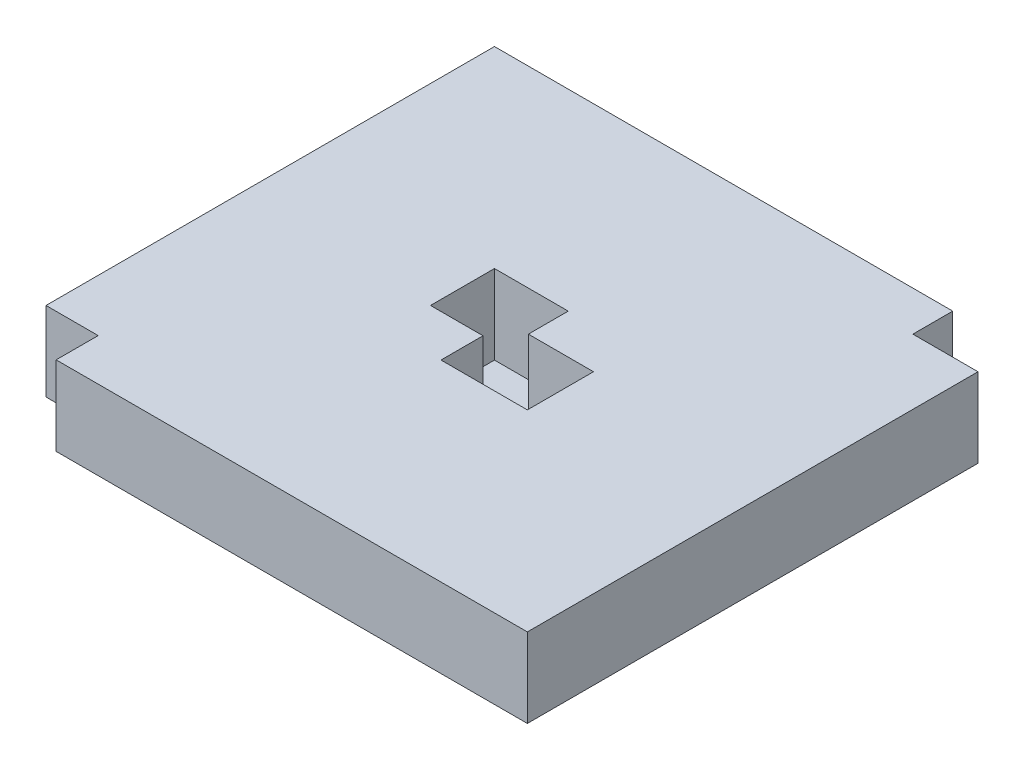
ISO-10303-21;
HEADER;
FILE_DESCRIPTION(('STEP AP214'),'2;1');
FILE_NAME('part.step','',(''),(''),'','','');
FILE_SCHEMA(('AUTOMOTIVE_DESIGN { 1 0 10303 214 1 1 1 1 }'));
ENDSEC;
DATA;
#1=APPLICATION_CONTEXT('core data for automotive mechanical design processes');
#2=APPLICATION_PROTOCOL_DEFINITION('international standard','automotive_design',2000,#1);
#3=PRODUCT_CONTEXT('',#1,'mechanical');
#4=PRODUCT('Part','Part','',(#3));
#5=PRODUCT_RELATED_PRODUCT_CATEGORY('part','',(#4));
#6=PRODUCT_DEFINITION_FORMATION('','',#4);
#7=PRODUCT_DEFINITION_CONTEXT('part definition',#1,'design');
#8=PRODUCT_DEFINITION('design','',#6,#7);
#9=PRODUCT_DEFINITION_SHAPE('','',#8);
#10=(LENGTH_UNIT() NAMED_UNIT(*) SI_UNIT(.MILLI.,.METRE.));
#11=(NAMED_UNIT(*) PLANE_ANGLE_UNIT() SI_UNIT($,.RADIAN.));
#12=(NAMED_UNIT(*) SI_UNIT($,.STERADIAN.) SOLID_ANGLE_UNIT());
#13=UNCERTAINTY_MEASURE_WITH_UNIT(LENGTH_MEASURE(1.E-05),#10,'distance_accuracy_value','');
#14=(GEOMETRIC_REPRESENTATION_CONTEXT(3) GLOBAL_UNCERTAINTY_ASSIGNED_CONTEXT((#13)) GLOBAL_UNIT_ASSIGNED_CONTEXT((#10,
#11,#12)) REPRESENTATION_CONTEXT('',''));
#15=CARTESIAN_POINT('',(0.,0.,0.));
#16=DIRECTION('',(0.,0.,1.));
#17=DIRECTION('',(1.,0.,0.));
#18=AXIS2_PLACEMENT_3D('',#15,#16,#17);
#19=CARTESIAN_POINT('',(0.,33.,0.));
#20=DIRECTION('',(0.,-1.,0.));
#21=DIRECTION('',(0.,0.,-1.));
#22=AXIS2_PLACEMENT_3D('',#19,#20,#21);
#23=CYLINDRICAL_SURFACE('',#22,49.571868137868);
#24=CARTESIAN_POINT('',(0.,33.,0.));
#25=DIRECTION('',(0.,1.,0.));
#26=DIRECTION('',(0.,0.,1.));
#27=AXIS2_PLACEMENT_3D('',#24,#25,#26);
#28=CIRCLE('',#27,49.571868137868);
#29=CARTESIAN_POINT('',(0.,33.,49.571868137868));
#30=VERTEX_POINT('',#29);
#31=EDGE_CURVE('E12',#30,#30,#28,.T.);
#32=ORIENTED_EDGE('',*,*,#31,.F.);
#33=EDGE_LOOP('',(#32));
#34=FACE_BOUND('',#33,.T.);
#35=CARTESIAN_POINT('',(0.,0.,0.));
#36=DIRECTION('',(0.,1.,0.));
#37=DIRECTION('',(0.,0.,1.));
#38=AXIS2_PLACEMENT_3D('',#35,#36,#37);
#39=CIRCLE('',#38,49.571868137868);
#40=CARTESIAN_POINT('',(0.,0.,49.571868137868));
#41=VERTEX_POINT('',#40);
#42=EDGE_CURVE('E99',#41,#41,#39,.T.);
#43=ORIENTED_EDGE('',*,*,#42,.T.);
#44=EDGE_LOOP('',(#43));
#45=FACE_BOUND('',#44,.T.);
#46=ADVANCED_FACE('F96',(#34,#45),#23,.T.);
#47=CARTESIAN_POINT('',(0.,0.,0.));
#48=DIRECTION('',(0.,1.,0.));
#49=DIRECTION('',(0.,0.,1.));
#50=AXIS2_PLACEMENT_3D('',#47,#48,#49);
#51=PLANE('',#50);
#52=ORIENTED_EDGE('',*,*,#42,.F.);
#53=EDGE_LOOP('',(#52));
#54=FACE_BOUND('',#53,.T.);
#55=ADVANCED_FACE('F340',(#54),#51,.F.);
#56=CARTESIAN_POINT('',(0.,66.,-90.0240440142948));
#57=DIRECTION('',(0.,0.,1.));
#58=DIRECTION('',(1.,0.,0.));
#59=AXIS2_PLACEMENT_3D('',#56,#57,#58);
#60=PLANE('',#59);
#61=DIRECTION('',(0.,-1.,0.));
#62=VECTOR('',#61,1.);
#63=CARTESIAN_POINT('',(80.,66.,-90.0240440142948));
#64=LINE('',#63,#62);
#65=CARTESIAN_POINT('',(80.,66.,-90.0240440142948));
#66=VERTEX_POINT('',#65);
#67=CARTESIAN_POINT('',(80.,33.,-90.0240440142948));
#68=VERTEX_POINT('',#67);
#69=EDGE_CURVE('E227',#66,#68,#64,.T.);
#70=ORIENTED_EDGE('',*,*,#69,.F.);
#71=DIRECTION('',(-1.,0.,0.));
#72=VECTOR('',#71,1.);
#73=CARTESIAN_POINT('',(0.,66.,-90.0240440142948));
#74=LINE('',#73,#72);
#75=CARTESIAN_POINT('',(107.09948450761,66.,-90.0240440142948));
#76=VERTEX_POINT('',#75);
#77=EDGE_CURVE('E283',#76,#66,#74,.T.);
#78=ORIENTED_EDGE('',*,*,#77,.F.);
#79=DIRECTION('',(0.,-1.,0.));
#80=VECTOR('',#79,1.);
#81=CARTESIAN_POINT('',(107.09948450761,66.,-90.0240440142948));
#82=LINE('',#81,#80);
#83=CARTESIAN_POINT('',(107.09948450761,33.,-90.0240440142948));
#84=VERTEX_POINT('',#83);
#85=EDGE_CURVE('E301',#76,#84,#82,.T.);
#86=ORIENTED_EDGE('',*,*,#85,.T.);
#87=DIRECTION('',(-1.,0.,0.));
#88=VECTOR('',#87,1.);
#89=CARTESIAN_POINT('',(0.,33.,-90.0240440142948));
#90=LINE('',#89,#88);
#91=EDGE_CURVE('E282',#84,#68,#90,.T.);
#92=ORIENTED_EDGE('',*,*,#91,.T.);
#93=EDGE_LOOP('',(#70,#78,#86,#92));
#94=FACE_BOUND('',#93,.T.);
#95=ADVANCED_FACE('F342',(#94),#60,.F.);
#96=CARTESIAN_POINT('',(-88.9870739438504,66.,0.));
#97=DIRECTION('',(1.,0.,0.));
#98=DIRECTION('',(0.,0.,-1.));
#99=AXIS2_PLACEMENT_3D('',#96,#97,#98);
#100=PLANE('',#99);
#101=DIRECTION('',(0.,1.,0.));
#102=VECTOR('',#101,1.);
#103=CARTESIAN_POINT('',(-88.9870739438504,66.,80.));
#104=LINE('',#103,#102);
#105=CARTESIAN_POINT('',(-88.9870739438504,33.,80.));
#106=VERTEX_POINT('',#105);
#107=CARTESIAN_POINT('',(-88.9870739438504,66.,80.));
#108=VERTEX_POINT('',#107);
#109=EDGE_CURVE('E279',#106,#108,#104,.T.);
#110=ORIENTED_EDGE('',*,*,#109,.F.);
#111=DIRECTION('',(0.,0.,-1.));
#112=VECTOR('',#111,1.);
#113=CARTESIAN_POINT('',(-88.9870739438504,33.,0.));
#114=LINE('',#113,#112);
#115=CARTESIAN_POINT('',(-88.9870739438504,33.,97.4902285214933));
#116=VERTEX_POINT('',#115);
#117=EDGE_CURVE('E313',#106,#116,#114,.F.);
#118=ORIENTED_EDGE('',*,*,#117,.T.);
#119=DIRECTION('',(0.,-1.,0.));
#120=VECTOR('',#119,1.);
#121=CARTESIAN_POINT('',(-88.9870739438504,66.,97.4902285214933));
#122=LINE('',#121,#120);
#123=CARTESIAN_POINT('',(-88.9870739438504,66.,97.4902285214933));
#124=VERTEX_POINT('',#123);
#125=EDGE_CURVE('E323',#124,#116,#122,.T.);
#126=ORIENTED_EDGE('',*,*,#125,.F.);
#127=DIRECTION('',(0.,0.,-1.));
#128=VECTOR('',#127,1.);
#129=CARTESIAN_POINT('',(-88.9870739438504,66.,0.));
#130=LINE('',#129,#128);
#131=EDGE_CURVE('E218',#108,#124,#130,.F.);
#132=ORIENTED_EDGE('',*,*,#131,.F.);
#133=EDGE_LOOP('',(#110,#118,#126,#132));
#134=FACE_BOUND('',#133,.T.);
#135=ADVANCED_FACE('F347',(#134),#100,.F.);
#136=CARTESIAN_POINT('',(0.,66.,-10.0240440142948));
#137=DIRECTION('',(-1.,0.,0.));
#138=DIRECTION('',(0.,0.,1.));
#139=AXIS2_PLACEMENT_3D('',#136,#137,#138);
#140=PLANE('',#139);
#141=DIRECTION('',(0.,0.,-1.));
#142=VECTOR('',#141,1.);
#143=CARTESIAN_POINT('',(0.,66.,-10.0240440142948));
#144=LINE('',#143,#142);
#145=CARTESIAN_POINT('',(0.,66.,-10.0240440142948));
#146=VERTEX_POINT('',#145);
#147=CARTESIAN_POINT('',(0.,66.,-26.6155651414032));
#148=VERTEX_POINT('',#147);
#149=EDGE_CURVE('E286',#146,#148,#144,.T.);
#150=ORIENTED_EDGE('',*,*,#149,.T.);
#151=DIRECTION('',(0.,-1.,0.));
#152=VECTOR('',#151,1.);
#153=CARTESIAN_POINT('',(0.,66.,-26.6155651414032));
#154=LINE('',#153,#152);
#155=CARTESIAN_POINT('',(0.,33.,-26.6155651414032));
#156=VERTEX_POINT('',#155);
#157=EDGE_CURVE('E270',#148,#156,#154,.T.);
#158=ORIENTED_EDGE('',*,*,#157,.T.);
#159=DIRECTION('',(0.,0.,-1.));
#160=VECTOR('',#159,1.);
#161=CARTESIAN_POINT('',(0.,33.,-10.0240440142948));
#162=LINE('',#161,#160);
#163=CARTESIAN_POINT('',(0.,33.,-10.0240440142948));
#164=VERTEX_POINT('',#163);
#165=EDGE_CURVE('E115',#164,#156,#162,.T.);
#166=ORIENTED_EDGE('',*,*,#165,.F.);
#167=DIRECTION('',(0.,-1.,0.));
#168=VECTOR('',#167,1.);
#169=CARTESIAN_POINT('',(0.,66.,-10.0240440142948));
#170=LINE('',#169,#168);
#171=EDGE_CURVE('E332',#146,#164,#170,.T.);
#172=ORIENTED_EDGE('',*,*,#171,.F.);
#173=EDGE_LOOP('',(#150,#158,#166,#172));
#174=FACE_BOUND('',#173,.T.);
#175=ADVANCED_FACE('F355',(#174),#140,.T.);
#176=CARTESIAN_POINT('',(0.,66.,-10.0240440142948));
#177=DIRECTION('',(0.,0.,1.));
#178=DIRECTION('',(1.,0.,0.));
#179=AXIS2_PLACEMENT_3D('',#176,#177,#178);
#180=PLANE('',#179);
#181=DIRECTION('',(-1.,0.,0.));
#182=VECTOR('',#181,1.);
#183=CARTESIAN_POINT('',(0.,33.,-10.0240440142948));
#184=LINE('',#183,#182);
#185=CARTESIAN_POINT('',(27.0994845076104,33.,-10.0240440142948));
#186=VERTEX_POINT('',#185);
#187=EDGE_CURVE('E305',#186,#164,#184,.T.);
#188=ORIENTED_EDGE('',*,*,#187,.F.);
#189=DIRECTION('',(0.,-1.,0.));
#190=VECTOR('',#189,1.);
#191=CARTESIAN_POINT('',(27.0994845076104,66.,-10.0240440142948));
#192=LINE('',#191,#190);
#193=CARTESIAN_POINT('',(27.0994845076104,66.,-10.0240440142948));
#194=VERTEX_POINT('',#193);
#195=EDGE_CURVE('E329',#194,#186,#192,.T.);
#196=ORIENTED_EDGE('',*,*,#195,.F.);
#197=DIRECTION('',(-1.,0.,0.));
#198=VECTOR('',#197,1.);
#199=CARTESIAN_POINT('',(0.,66.,-10.0240440142948));
#200=LINE('',#199,#198);
#201=EDGE_CURVE('E289',#194,#146,#200,.T.);
#202=ORIENTED_EDGE('',*,*,#201,.T.);
#203=ORIENTED_EDGE('',*,*,#171,.T.);
#204=EDGE_LOOP('',(#188,#196,#202,#203));
#205=FACE_BOUND('',#204,.T.);
#206=ADVANCED_FACE('F358',(#205),#180,.T.);
#207=CARTESIAN_POINT('',(27.0994845076104,66.,-10.0240440142948));
#208=DIRECTION('',(-1.,0.,0.));
#209=DIRECTION('',(0.,0.,1.));
#210=AXIS2_PLACEMENT_3D('',#207,#208,#209);
#211=PLANE('',#210);
#212=DIRECTION('',(0.,0.,-1.));
#213=VECTOR('',#212,1.);
#214=CARTESIAN_POINT('',(27.0994845076104,33.,-10.0240440142948));
#215=LINE('',#214,#213);
#216=CARTESIAN_POINT('',(27.0994845076104,33.,17.4902285214933));
#217=VERTEX_POINT('',#216);
#218=EDGE_CURVE('E307',#217,#186,#215,.T.);
#219=ORIENTED_EDGE('',*,*,#218,.F.);
#220=DIRECTION('',(0.,-1.,0.));
#221=VECTOR('',#220,1.);
#222=CARTESIAN_POINT('',(27.0994845076104,66.,17.4902285214933));
#223=LINE('',#222,#221);
#224=CARTESIAN_POINT('',(27.0994845076104,66.,17.4902285214933));
#225=VERTEX_POINT('',#224);
#226=EDGE_CURVE('E326',#225,#217,#223,.T.);
#227=ORIENTED_EDGE('',*,*,#226,.F.);
#228=DIRECTION('',(0.,0.,-1.));
#229=VECTOR('',#228,1.);
#230=CARTESIAN_POINT('',(27.0994845076104,66.,-10.0240440142948));
#231=LINE('',#230,#229);
#232=EDGE_CURVE('E292',#225,#194,#231,.T.);
#233=ORIENTED_EDGE('',*,*,#232,.T.);
#234=ORIENTED_EDGE('',*,*,#195,.T.);
#235=EDGE_LOOP('',(#219,#227,#233,#234));
#236=FACE_BOUND('',#235,.T.);
#237=ADVANCED_FACE('F362',(#236),#211,.T.);
#238=CARTESIAN_POINT('',(-8.98707394385037,66.,17.4902285214933));
#239=DIRECTION('',(0.,0.,-1.));
#240=DIRECTION('',(-1.,0.,0.));
#241=AXIS2_PLACEMENT_3D('',#238,#239,#240);
#242=PLANE('',#241);
#243=DIRECTION('',(0.,-1.,0.));
#244=VECTOR('',#243,1.);
#245=CARTESIAN_POINT('',(-8.84881126779113,66.,17.4902285214933));
#246=LINE('',#245,#244);
#247=CARTESIAN_POINT('',(-8.84881126779113,66.,17.4902285214933));
#248=VERTEX_POINT('',#247);
#249=CARTESIAN_POINT('',(-8.84881126779113,33.,17.4902285214933));
#250=VERTEX_POINT('',#249);
#251=EDGE_CURVE('E277',#248,#250,#246,.T.);
#252=ORIENTED_EDGE('',*,*,#251,.F.);
#253=DIRECTION('',(1.,0.,0.));
#254=VECTOR('',#253,1.);
#255=CARTESIAN_POINT('',(-8.98707394385037,66.,17.4902285214933));
#256=LINE('',#255,#254);
#257=EDGE_CURVE('E219',#248,#225,#256,.T.);
#258=ORIENTED_EDGE('',*,*,#257,.T.);
#259=ORIENTED_EDGE('',*,*,#226,.T.);
#260=DIRECTION('',(1.,0.,0.));
#261=VECTOR('',#260,1.);
#262=CARTESIAN_POINT('',(-8.98707394385037,33.,17.4902285214933));
#263=LINE('',#262,#261);
#264=EDGE_CURVE('E309',#250,#217,#263,.T.);
#265=ORIENTED_EDGE('',*,*,#264,.F.);
#266=EDGE_LOOP('',(#252,#258,#259,#265));
#267=FACE_BOUND('',#266,.T.);
#268=ADVANCED_FACE('F365',(#267),#242,.T.);
#269=CARTESIAN_POINT('',(-88.9870739438504,66.,0.));
#270=DIRECTION('',(0.,0.,-1.));
#271=DIRECTION('',(-1.,0.,0.));
#272=AXIS2_PLACEMENT_3D('',#269,#270,#271);
#273=PLANE('',#272);
#274=DIRECTION('',(0.,-1.,0.));
#275=VECTOR('',#274,1.);
#276=CARTESIAN_POINT('',(-30.6943140851505,66.,0.));
#277=LINE('',#276,#275);
#278=CARTESIAN_POINT('',(-30.6943140851505,66.,0.));
#279=VERTEX_POINT('',#278);
#280=CARTESIAN_POINT('',(-30.6943140851505,33.,0.));
#281=VERTEX_POINT('',#280);
#282=EDGE_CURVE('E213',#279,#281,#277,.T.);
#283=ORIENTED_EDGE('',*,*,#282,.F.);
#284=DIRECTION('',(1.,0.,0.));
#285=VECTOR('',#284,1.);
#286=CARTESIAN_POINT('',(-88.9870739438504,66.,0.));
#287=LINE('',#286,#285);
#288=CARTESIAN_POINT('',(-8.84881126779113,66.,0.));
#289=VERTEX_POINT('',#288);
#290=EDGE_CURVE('E206',#279,#289,#287,.T.);
#291=ORIENTED_EDGE('',*,*,#290,.T.);
#292=DIRECTION('',(0.,-1.,0.));
#293=VECTOR('',#292,1.);
#294=CARTESIAN_POINT('',(-8.84881126779113,66.,0.));
#295=LINE('',#294,#293);
#296=CARTESIAN_POINT('',(-8.84881126779113,33.,0.));
#297=VERTEX_POINT('',#296);
#298=EDGE_CURVE('E210',#289,#297,#295,.T.);
#299=ORIENTED_EDGE('',*,*,#298,.T.);
#300=DIRECTION('',(1.,0.,0.));
#301=VECTOR('',#300,1.);
#302=CARTESIAN_POINT('',(-88.9870739438504,33.,0.));
#303=LINE('',#302,#301);
#304=EDGE_CURVE('E311',#281,#297,#303,.T.);
#305=ORIENTED_EDGE('',*,*,#304,.F.);
#306=EDGE_LOOP('',(#283,#291,#299,#305));
#307=FACE_BOUND('',#306,.T.);
#308=ADVANCED_FACE('F208',(#307),#273,.T.);
#309=CARTESIAN_POINT('',(-8.98707394385037,66.,97.4902285214933));
#310=DIRECTION('',(0.,0.,-1.));
#311=DIRECTION('',(-1.,0.,0.));
#312=AXIS2_PLACEMENT_3D('',#309,#310,#311);
#313=PLANE('',#312);
#314=DIRECTION('',(1.,0.,0.));
#315=VECTOR('',#314,1.);
#316=CARTESIAN_POINT('',(-8.98707394385037,33.,97.4902285214933));
#317=LINE('',#316,#315);
#318=CARTESIAN_POINT('',(107.09948450761,33.,97.4902285214933));
#319=VERTEX_POINT('',#318);
#320=EDGE_CURVE('E315',#116,#319,#317,.T.);
#321=ORIENTED_EDGE('',*,*,#320,.T.);
#322=DIRECTION('',(0.,-1.,0.));
#323=VECTOR('',#322,1.);
#324=CARTESIAN_POINT('',(107.09948450761,66.,97.4902285214933));
#325=LINE('',#324,#323);
#326=CARTESIAN_POINT('',(107.09948450761,66.,97.4902285214933));
#327=VERTEX_POINT('',#326);
#328=EDGE_CURVE('E320',#327,#319,#325,.T.);
#329=ORIENTED_EDGE('',*,*,#328,.F.);
#330=DIRECTION('',(1.,0.,0.));
#331=VECTOR('',#330,1.);
#332=CARTESIAN_POINT('',(-8.98707394385037,66.,97.4902285214933));
#333=LINE('',#332,#331);
#334=EDGE_CURVE('E297',#124,#327,#333,.T.);
#335=ORIENTED_EDGE('',*,*,#334,.F.);
#336=ORIENTED_EDGE('',*,*,#125,.T.);
#337=EDGE_LOOP('',(#321,#329,#335,#336));
#338=FACE_BOUND('',#337,.T.);
#339=ADVANCED_FACE('F372',(#338),#313,.F.);
#340=CARTESIAN_POINT('',(107.09948450761,66.,-10.0240440142948));
#341=DIRECTION('',(-1.,0.,0.));
#342=DIRECTION('',(0.,0.,1.));
#343=AXIS2_PLACEMENT_3D('',#340,#341,#342);
#344=PLANE('',#343);
#345=DIRECTION('',(0.,0.,-1.));
#346=VECTOR('',#345,1.);
#347=CARTESIAN_POINT('',(107.09948450761,33.,-10.0240440142948));
#348=LINE('',#347,#346);
#349=EDGE_CURVE('E287',#319,#84,#348,.T.);
#350=ORIENTED_EDGE('',*,*,#349,.T.);
#351=ORIENTED_EDGE('',*,*,#85,.F.);
#352=DIRECTION('',(0.,0.,-1.));
#353=VECTOR('',#352,1.);
#354=CARTESIAN_POINT('',(107.09948450761,66.,-10.0240440142948));
#355=LINE('',#354,#353);
#356=EDGE_CURVE('E299',#327,#76,#355,.T.);
#357=ORIENTED_EDGE('',*,*,#356,.F.);
#358=ORIENTED_EDGE('',*,*,#328,.T.);
#359=EDGE_LOOP('',(#350,#351,#357,#358));
#360=FACE_BOUND('',#359,.T.);
#361=ADVANCED_FACE('F378',(#360),#344,.F.);
#362=CARTESIAN_POINT('',(0.,66.,0.));
#363=DIRECTION('',(0.,-1.,0.));
#364=DIRECTION('',(-1.,0.,0.));
#365=AXIS2_PLACEMENT_3D('',#362,#363,#364);
#366=PLANE('',#365);
#367=ORIENTED_EDGE('',*,*,#77,.T.);
#368=DIRECTION('',(0.,0.,-1.));
#369=VECTOR('',#368,1.);
#370=CARTESIAN_POINT('',(80.,66.,-26.6155651414032));
#371=LINE('',#370,#369);
#372=CARTESIAN_POINT('',(80.,66.,-106.615565141403));
#373=VERTEX_POINT('',#372);
#374=EDGE_CURVE('E243',#66,#373,#371,.T.);
#375=ORIENTED_EDGE('',*,*,#374,.T.);
#376=DIRECTION('',(1.,0.,0.));
#377=VECTOR('',#376,1.);
#378=CARTESIAN_POINT('',(-30.6943140851505,66.,-106.615565141403));
#379=LINE('',#378,#377);
#380=CARTESIAN_POINT('',(-110.694314085151,66.,-106.615565141403));
#381=VERTEX_POINT('',#380);
#382=EDGE_CURVE('E245',#373,#381,#379,.F.);
#383=ORIENTED_EDGE('',*,*,#382,.T.);
#384=DIRECTION('',(0.,0.,-1.));
#385=VECTOR('',#384,1.);
#386=CARTESIAN_POINT('',(-110.694314085151,66.,-26.6155651414032));
#387=LINE('',#386,#385);
#388=CARTESIAN_POINT('',(-110.694314085151,66.,80.));
#389=VERTEX_POINT('',#388);
#390=EDGE_CURVE('E247',#381,#389,#387,.F.);
#391=ORIENTED_EDGE('',*,*,#390,.T.);
#392=DIRECTION('',(1.,0.,0.));
#393=VECTOR('',#392,1.);
#394=CARTESIAN_POINT('',(-30.6943140851505,66.,80.));
#395=LINE('',#394,#393);
#396=EDGE_CURVE('E233',#389,#108,#395,.T.);
#397=ORIENTED_EDGE('',*,*,#396,.T.);
#398=ORIENTED_EDGE('',*,*,#131,.T.);
#399=ORIENTED_EDGE('',*,*,#334,.T.);
#400=ORIENTED_EDGE('',*,*,#356,.T.);
#401=EDGE_LOOP('',(#367,#375,#383,#391,#397,#398,#399,#400));
#402=FACE_BOUND('',#401,.T.);
#403=ORIENTED_EDGE('',*,*,#257,.F.);
#404=DIRECTION('',(0.,0.,1.));
#405=VECTOR('',#404,1.);
#406=CARTESIAN_POINT('',(-8.84881126779113,66.,0.));
#407=LINE('',#406,#405);
#408=EDGE_CURVE('E224',#289,#248,#407,.T.);
#409=ORIENTED_EDGE('',*,*,#408,.F.);
#410=ORIENTED_EDGE('',*,*,#290,.F.);
#411=DIRECTION('',(0.,0.,1.));
#412=VECTOR('',#411,1.);
#413=CARTESIAN_POINT('',(-30.6943140851505,66.,-26.6155651414032));
#414=LINE('',#413,#412);
#415=CARTESIAN_POINT('',(-30.6943140851505,66.,-26.6155651414032));
#416=VERTEX_POINT('',#415);
#417=EDGE_CURVE('E232',#416,#279,#414,.T.);
#418=ORIENTED_EDGE('',*,*,#417,.F.);
#419=DIRECTION('',(-1.,0.,0.));
#420=VECTOR('',#419,1.);
#421=CARTESIAN_POINT('',(-30.6943140851505,66.,-26.6155651414032));
#422=LINE('',#421,#420);
#423=EDGE_CURVE('E235',#148,#416,#422,.T.);
#424=ORIENTED_EDGE('',*,*,#423,.F.);
#425=ORIENTED_EDGE('',*,*,#149,.F.);
#426=ORIENTED_EDGE('',*,*,#201,.F.);
#427=ORIENTED_EDGE('',*,*,#232,.F.);
#428=EDGE_LOOP('',(#403,#409,#410,#418,#424,#425,#426,#427));
#429=FACE_BOUND('',#428,.T.);
#430=ADVANCED_FACE('F230',(#402,#429),#366,.F.);
#431=CARTESIAN_POINT('',(0.,33.,0.));
#432=DIRECTION('',(0.,-1.,0.));
#433=DIRECTION('',(-1.,0.,0.));
#434=AXIS2_PLACEMENT_3D('',#431,#432,#433);
#435=PLANE('',#434);
#436=ORIENTED_EDGE('',*,*,#31,.T.);
#437=EDGE_LOOP('',(#436));
#438=FACE_BOUND('',#437,.T.);
#439=DIRECTION('',(0.,0.,-1.));
#440=VECTOR('',#439,1.);
#441=CARTESIAN_POINT('',(80.,33.,-26.6155651414032));
#442=LINE('',#441,#440);
#443=CARTESIAN_POINT('',(80.,33.,-106.615565141403));
#444=VERTEX_POINT('',#443);
#445=EDGE_CURVE('E257',#68,#444,#442,.T.);
#446=ORIENTED_EDGE('',*,*,#445,.F.);
#447=ORIENTED_EDGE('',*,*,#91,.F.);
#448=ORIENTED_EDGE('',*,*,#349,.F.);
#449=ORIENTED_EDGE('',*,*,#320,.F.);
#450=ORIENTED_EDGE('',*,*,#117,.F.);
#451=DIRECTION('',(1.,0.,0.));
#452=VECTOR('',#451,1.);
#453=CARTESIAN_POINT('',(-30.6943140851505,33.,80.));
#454=LINE('',#453,#452);
#455=CARTESIAN_POINT('',(-110.694314085151,33.,80.));
#456=VERTEX_POINT('',#455);
#457=EDGE_CURVE('E250',#456,#106,#454,.T.);
#458=ORIENTED_EDGE('',*,*,#457,.F.);
#459=DIRECTION('',(0.,0.,-1.));
#460=VECTOR('',#459,1.);
#461=CARTESIAN_POINT('',(-110.694314085151,33.,-26.6155651414032));
#462=LINE('',#461,#460);
#463=CARTESIAN_POINT('',(-110.694314085151,33.,-106.615565141403));
#464=VERTEX_POINT('',#463);
#465=EDGE_CURVE('E238',#464,#456,#462,.F.);
#466=ORIENTED_EDGE('',*,*,#465,.F.);
#467=DIRECTION('',(1.,0.,0.));
#468=VECTOR('',#467,1.);
#469=CARTESIAN_POINT('',(-30.6943140851505,33.,-106.615565141403));
#470=LINE('',#469,#468);
#471=EDGE_CURVE('E259',#444,#464,#470,.F.);
#472=ORIENTED_EDGE('',*,*,#471,.F.);
#473=EDGE_LOOP('',(#446,#447,#448,#449,#450,#458,#466,#472));
#474=FACE_BOUND('',#473,.T.);
#475=ADVANCED_FACE('F383',(#438,#474),#435,.T.);
#476=CARTESIAN_POINT('',(-30.6943140851505,66.,-106.615565141403));
#477=DIRECTION('',(0.,0.,1.));
#478=DIRECTION('',(1.,0.,0.));
#479=AXIS2_PLACEMENT_3D('',#476,#477,#478);
#480=PLANE('',#479);
#481=ORIENTED_EDGE('',*,*,#471,.T.);
#482=DIRECTION('',(0.,-1.,0.));
#483=VECTOR('',#482,1.);
#484=CARTESIAN_POINT('',(-110.694314085151,66.,-106.615565141403));
#485=LINE('',#484,#483);
#486=EDGE_CURVE('E264',#381,#464,#485,.T.);
#487=ORIENTED_EDGE('',*,*,#486,.F.);
#488=ORIENTED_EDGE('',*,*,#382,.F.);
#489=DIRECTION('',(0.,-1.,0.));
#490=VECTOR('',#489,1.);
#491=CARTESIAN_POINT('',(80.,66.,-106.615565141403));
#492=LINE('',#491,#490);
#493=EDGE_CURVE('E267',#373,#444,#492,.T.);
#494=ORIENTED_EDGE('',*,*,#493,.T.);
#495=EDGE_LOOP('',(#481,#487,#488,#494));
#496=FACE_BOUND('',#495,.T.);
#497=ADVANCED_FACE('F386',(#496),#480,.F.);
#498=CARTESIAN_POINT('',(-110.694314085151,66.,-26.6155651414032));
#499=DIRECTION('',(1.,0.,0.));
#500=DIRECTION('',(0.,0.,-1.));
#501=AXIS2_PLACEMENT_3D('',#498,#499,#500);
#502=PLANE('',#501);
#503=ORIENTED_EDGE('',*,*,#465,.T.);
#504=DIRECTION('',(0.,-1.,0.));
#505=VECTOR('',#504,1.);
#506=CARTESIAN_POINT('',(-110.694314085151,66.,80.));
#507=LINE('',#506,#505);
#508=EDGE_CURVE('E249',#389,#456,#507,.T.);
#509=ORIENTED_EDGE('',*,*,#508,.F.);
#510=ORIENTED_EDGE('',*,*,#390,.F.);
#511=ORIENTED_EDGE('',*,*,#486,.T.);
#512=EDGE_LOOP('',(#503,#509,#510,#511));
#513=FACE_BOUND('',#512,.T.);
#514=ADVANCED_FACE('F395',(#513),#502,.F.);
#515=CARTESIAN_POINT('',(-30.6943140851505,66.,80.));
#516=DIRECTION('',(0.,0.,-1.));
#517=DIRECTION('',(-1.,0.,0.));
#518=AXIS2_PLACEMENT_3D('',#515,#516,#517);
#519=PLANE('',#518);
#520=ORIENTED_EDGE('',*,*,#457,.T.);
#521=ORIENTED_EDGE('',*,*,#109,.T.);
#522=ORIENTED_EDGE('',*,*,#396,.F.);
#523=ORIENTED_EDGE('',*,*,#508,.T.);
#524=EDGE_LOOP('',(#520,#521,#522,#523));
#525=FACE_BOUND('',#524,.T.);
#526=ADVANCED_FACE('F391',(#525),#519,.F.);
#527=CARTESIAN_POINT('',(-30.6943140851505,66.,-26.6155651414032));
#528=DIRECTION('',(1.,0.,0.));
#529=DIRECTION('',(0.,0.,-1.));
#530=AXIS2_PLACEMENT_3D('',#527,#528,#529);
#531=PLANE('',#530);
#532=DIRECTION('',(0.,0.,1.));
#533=VECTOR('',#532,1.);
#534=CARTESIAN_POINT('',(-30.6943140851505,33.,-26.6155651414032));
#535=LINE('',#534,#533);
#536=CARTESIAN_POINT('',(-30.6943140851505,33.,-26.6155651414032));
#537=VERTEX_POINT('',#536);
#538=EDGE_CURVE('E254',#537,#281,#535,.T.);
#539=ORIENTED_EDGE('',*,*,#538,.F.);
#540=DIRECTION('',(0.,-1.,0.));
#541=VECTOR('',#540,1.);
#542=CARTESIAN_POINT('',(-30.6943140851505,66.,-26.6155651414032));
#543=LINE('',#542,#541);
#544=EDGE_CURVE('E273',#416,#537,#543,.T.);
#545=ORIENTED_EDGE('',*,*,#544,.F.);
#546=ORIENTED_EDGE('',*,*,#417,.T.);
#547=ORIENTED_EDGE('',*,*,#282,.T.);
#548=EDGE_LOOP('',(#539,#545,#546,#547));
#549=FACE_BOUND('',#548,.T.);
#550=ADVANCED_FACE('F394',(#549),#531,.T.);
#551=CARTESIAN_POINT('',(-30.6943140851505,66.,-26.6155651414032));
#552=DIRECTION('',(0.,0.,1.));
#553=DIRECTION('',(1.,0.,0.));
#554=AXIS2_PLACEMENT_3D('',#551,#552,#553);
#555=PLANE('',#554);
#556=DIRECTION('',(-1.,0.,0.));
#557=VECTOR('',#556,1.);
#558=CARTESIAN_POINT('',(-30.6943140851505,33.,-26.6155651414032));
#559=LINE('',#558,#557);
#560=EDGE_CURVE('E110',#156,#537,#559,.T.);
#561=ORIENTED_EDGE('',*,*,#560,.F.);
#562=ORIENTED_EDGE('',*,*,#157,.F.);
#563=ORIENTED_EDGE('',*,*,#423,.T.);
#564=ORIENTED_EDGE('',*,*,#544,.T.);
#565=EDGE_LOOP('',(#561,#562,#563,#564));
#566=FACE_BOUND('',#565,.T.);
#567=ADVANCED_FACE('F402',(#566),#555,.T.);
#568=CARTESIAN_POINT('',(80.,66.,-26.6155651414032));
#569=DIRECTION('',(-1.,0.,0.));
#570=DIRECTION('',(0.,0.,1.));
#571=AXIS2_PLACEMENT_3D('',#568,#569,#570);
#572=PLANE('',#571);
#573=ORIENTED_EDGE('',*,*,#374,.F.);
#574=ORIENTED_EDGE('',*,*,#69,.T.);
#575=ORIENTED_EDGE('',*,*,#445,.T.);
#576=ORIENTED_EDGE('',*,*,#493,.F.);
#577=EDGE_LOOP('',(#573,#574,#575,#576));
#578=FACE_BOUND('',#577,.T.);
#579=ADVANCED_FACE('F399',(#578),#572,.F.);
#580=CARTESIAN_POINT('',(-8.84881126779113,66.,0.));
#581=DIRECTION('',(1.,0.,0.));
#582=DIRECTION('',(0.,0.,-1.));
#583=AXIS2_PLACEMENT_3D('',#580,#581,#582);
#584=PLANE('',#583);
#585=ORIENTED_EDGE('',*,*,#408,.T.);
#586=ORIENTED_EDGE('',*,*,#251,.T.);
#587=DIRECTION('',(0.,0.,1.));
#588=VECTOR('',#587,1.);
#589=CARTESIAN_POINT('',(-8.84881126779113,33.,0.));
#590=LINE('',#589,#588);
#591=EDGE_CURVE('E226',#297,#250,#590,.T.);
#592=ORIENTED_EDGE('',*,*,#591,.F.);
#593=ORIENTED_EDGE('',*,*,#298,.F.);
#594=EDGE_LOOP('',(#585,#586,#592,#593));
#595=FACE_BOUND('',#594,.T.);
#596=ADVANCED_FACE('F222',(#595),#584,.T.);
#597=CARTESIAN_POINT('',(0.,33.,0.));
#598=DIRECTION('',(0.,1.,0.));
#599=DIRECTION('',(0.,0.,1.));
#600=AXIS2_PLACEMENT_3D('',#597,#598,#599);
#601=PLANE('',#600);
#602=ORIENTED_EDGE('',*,*,#538,.T.);
#603=ORIENTED_EDGE('',*,*,#304,.T.);
#604=ORIENTED_EDGE('',*,*,#591,.T.);
#605=ORIENTED_EDGE('',*,*,#264,.T.);
#606=ORIENTED_EDGE('',*,*,#218,.T.);
#607=ORIENTED_EDGE('',*,*,#187,.T.);
#608=ORIENTED_EDGE('',*,*,#165,.T.);
#609=ORIENTED_EDGE('',*,*,#560,.T.);
#610=EDGE_LOOP('',(#602,#603,#604,#605,#606,#607,#608,#609));
#611=FACE_BOUND('',#610,.T.);
#612=ADVANCED_FACE('F352',(#611),#601,.T.);
#613=CLOSED_SHELL('',(#46,#55,#95,#135,#175,#206,#237,#268,#308,#339,#361,#430,#475,#497,#514,
#526,#550,#567,#579,#596,#612));
#614=MANIFOLD_SOLID_BREP('B2',#613);
#615=ADVANCED_BREP_SHAPE_REPRESENTATION('',(#18,#614),#14);
#616=SHAPE_DEFINITION_REPRESENTATION(#9,#615);
ENDSEC;
END-ISO-10303-21;
